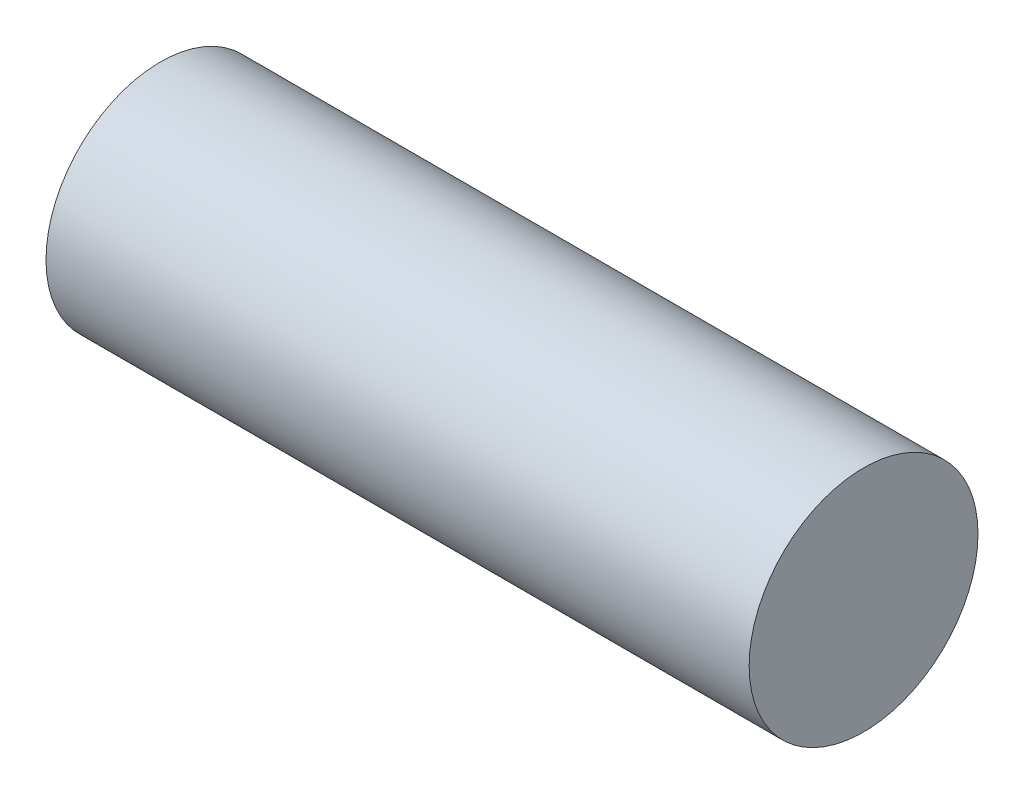
ISO-10303-21;
HEADER;
FILE_DESCRIPTION(('STEP AP214'),'2;1');
FILE_NAME('part.step','',(''),(''),'','','');
FILE_SCHEMA(('AUTOMOTIVE_DESIGN { 1 0 10303 214 1 1 1 1 }'));
ENDSEC;
DATA;
#1=APPLICATION_CONTEXT('core data for automotive mechanical design processes');
#2=APPLICATION_PROTOCOL_DEFINITION('international standard','automotive_design',2000,#1);
#3=PRODUCT_CONTEXT('',#1,'mechanical');
#4=PRODUCT('Part','Part','',(#3));
#5=PRODUCT_RELATED_PRODUCT_CATEGORY('part','',(#4));
#6=PRODUCT_DEFINITION_FORMATION('','',#4);
#7=PRODUCT_DEFINITION_CONTEXT('part definition',#1,'design');
#8=PRODUCT_DEFINITION('design','',#6,#7);
#9=PRODUCT_DEFINITION_SHAPE('','',#8);
#10=(LENGTH_UNIT() NAMED_UNIT(*) SI_UNIT(.MILLI.,.METRE.));
#11=(NAMED_UNIT(*) PLANE_ANGLE_UNIT() SI_UNIT($,.RADIAN.));
#12=(NAMED_UNIT(*) SI_UNIT($,.STERADIAN.) SOLID_ANGLE_UNIT());
#13=UNCERTAINTY_MEASURE_WITH_UNIT(LENGTH_MEASURE(1.E-05),#10,'distance_accuracy_value','');
#14=(GEOMETRIC_REPRESENTATION_CONTEXT(3) GLOBAL_UNCERTAINTY_ASSIGNED_CONTEXT((#13)) GLOBAL_UNIT_ASSIGNED_CONTEXT((#10,
#11,#12)) REPRESENTATION_CONTEXT('',''));
#15=CARTESIAN_POINT('',(0.,0.,0.));
#16=DIRECTION('',(0.,0.,1.));
#17=DIRECTION('',(1.,0.,0.));
#18=AXIS2_PLACEMENT_3D('',#15,#16,#17);
#19=CARTESIAN_POINT('',(-30.2164501574876,0.,0.));
#20=DIRECTION('',(1.,0.,0.));
#21=DIRECTION('',(0.,0.,-1.));
#22=AXIS2_PLACEMENT_3D('',#19,#20,#21);
#23=PLANE('',#22);
#24=CARTESIAN_POINT('',(-30.2164501574876,0.,0.));
#25=DIRECTION('',(1.,0.,0.));
#26=DIRECTION('',(0.,0.,-1.));
#27=AXIS2_PLACEMENT_3D('',#24,#25,#26);
#28=CIRCLE('',#27,15.15);
#29=CARTESIAN_POINT('',(-30.2164501574876,0.,-15.15));
#30=VERTEX_POINT('',#29);
#31=EDGE_CURVE('E47',#30,#30,#28,.T.);
#32=ORIENTED_EDGE('',*,*,#31,.T.);
#33=EDGE_LOOP('',(#32));
#34=FACE_BOUND('',#33,.T.);
#35=ADVANCED_FACE('F40',(#34),#23,.T.);
#36=CARTESIAN_POINT('',(-7.16577921758283,0.,0.));
#37=DIRECTION('',(-1.,0.,0.));
#38=DIRECTION('',(0.,0.,1.));
#39=AXIS2_PLACEMENT_3D('',#36,#37,#38);
#40=CYLINDRICAL_SURFACE('',#39,15.15);
#41=ORIENTED_EDGE('',*,*,#31,.F.);
#42=EDGE_LOOP('',(#41));
#43=FACE_BOUND('',#42,.T.);
#44=CARTESIAN_POINT('',(-123.316450157488,0.,0.));
#45=DIRECTION('',(-1.,0.,0.));
#46=DIRECTION('',(0.,0.,1.));
#47=AXIS2_PLACEMENT_3D('',#44,#45,#46);
#48=CIRCLE('',#47,15.15);
#49=CARTESIAN_POINT('',(-123.316450157488,0.,15.15));
#50=VERTEX_POINT('',#49);
#51=EDGE_CURVE('E11',#50,#50,#48,.T.);
#52=ORIENTED_EDGE('',*,*,#51,.F.);
#53=EDGE_LOOP('',(#52));
#54=FACE_BOUND('',#53,.T.);
#55=ADVANCED_FACE('F54',(#43,#54),#40,.T.);
#56=CARTESIAN_POINT('',(-123.316450157488,0.,0.));
#57=DIRECTION('',(-1.,0.,0.));
#58=DIRECTION('',(0.,0.,1.));
#59=AXIS2_PLACEMENT_3D('',#56,#57,#58);
#60=PLANE('',#59);
#61=ORIENTED_EDGE('',*,*,#51,.T.);
#62=EDGE_LOOP('',(#61));
#63=FACE_BOUND('',#62,.T.);
#64=ADVANCED_FACE('F42',(#63),#60,.T.);
#65=CLOSED_SHELL('',(#35,#55,#64));
#66=MANIFOLD_SOLID_BREP('B2',#65);
#67=ADVANCED_BREP_SHAPE_REPRESENTATION('',(#18,#66),#14);
#68=SHAPE_DEFINITION_REPRESENTATION(#9,#67);
ENDSEC;
END-ISO-10303-21;
